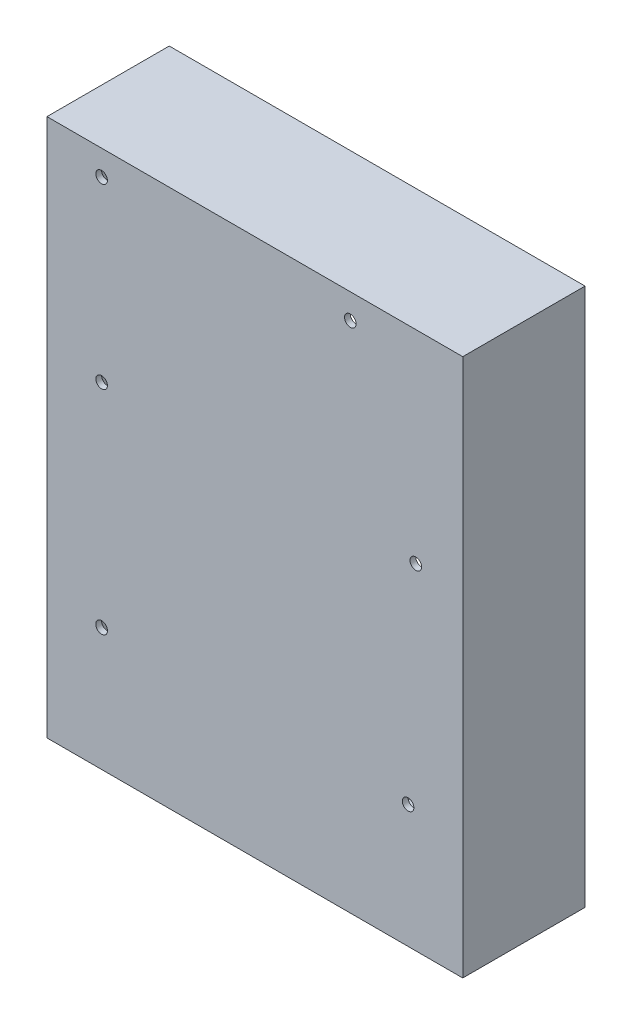
ISO-10303-21;
HEADER;
FILE_DESCRIPTION(('STEP AP214'),'2;1');
FILE_NAME('part.step','',(''),(''),'','','');
FILE_SCHEMA(('AUTOMOTIVE_DESIGN { 1 0 10303 214 1 1 1 1 }'));
ENDSEC;
DATA;
#1=APPLICATION_CONTEXT('core data for automotive mechanical design processes');
#2=APPLICATION_PROTOCOL_DEFINITION('international standard','automotive_design',2000,#1);
#3=PRODUCT_CONTEXT('',#1,'mechanical');
#4=PRODUCT('Part','Part','',(#3));
#5=PRODUCT_RELATED_PRODUCT_CATEGORY('part','',(#4));
#6=PRODUCT_DEFINITION_FORMATION('','',#4);
#7=PRODUCT_DEFINITION_CONTEXT('part definition',#1,'design');
#8=PRODUCT_DEFINITION('design','',#6,#7);
#9=PRODUCT_DEFINITION_SHAPE('','',#8);
#10=(LENGTH_UNIT() NAMED_UNIT(*) SI_UNIT(.MILLI.,.METRE.));
#11=(NAMED_UNIT(*) PLANE_ANGLE_UNIT() SI_UNIT($,.RADIAN.));
#12=(NAMED_UNIT(*) SI_UNIT($,.STERADIAN.) SOLID_ANGLE_UNIT());
#13=UNCERTAINTY_MEASURE_WITH_UNIT(LENGTH_MEASURE(1.E-05),#10,'distance_accuracy_value','');
#14=(GEOMETRIC_REPRESENTATION_CONTEXT(3) GLOBAL_UNCERTAINTY_ASSIGNED_CONTEXT((#13)) GLOBAL_UNIT_ASSIGNED_CONTEXT((#10,
#11,#12)) REPRESENTATION_CONTEXT('',''));
#15=CARTESIAN_POINT('',(0.,0.,0.));
#16=DIRECTION('',(0.,0.,1.));
#17=DIRECTION('',(1.,0.,0.));
#18=AXIS2_PLACEMENT_3D('',#15,#16,#17);
#19=CARTESIAN_POINT('',(-118.99799036646,197.340345361075,3.));
#20=DIRECTION('',(1.,0.,0.));
#21=DIRECTION('',(0.,1.,0.));
#22=AXIS2_PLACEMENT_3D('',#19,#20,#21);
#23=PLANE('',#22);
#24=DIRECTION('',(0.,0.,-1.));
#25=VECTOR('',#24,1.);
#26=CARTESIAN_POINT('',(-118.99799036646,197.340345361075,3.));
#27=LINE('',#26,#25);
#28=CARTESIAN_POINT('',(-118.99799036646,197.340345361075,3.));
#29=VERTEX_POINT('',#28);
#30=CARTESIAN_POINT('',(-118.99799036646,197.340345361075,-60.5));
#31=VERTEX_POINT('',#30);
#32=EDGE_CURVE('E154',#29,#31,#27,.T.);
#33=ORIENTED_EDGE('',*,*,#32,.T.);
#34=DIRECTION('',(0.,-1.,0.));
#35=VECTOR('',#34,1.);
#36=CARTESIAN_POINT('',(-118.99799036646,197.340345361075,-60.5));
#37=LINE('',#36,#35);
#38=CARTESIAN_POINT('',(-118.99799036646,-82.0596546389253,-60.5));
#39=VERTEX_POINT('',#38);
#40=EDGE_CURVE('E142',#31,#39,#37,.T.);
#41=ORIENTED_EDGE('',*,*,#40,.T.);
#42=DIRECTION('',(0.,0.,-1.));
#43=VECTOR('',#42,1.);
#44=CARTESIAN_POINT('',(-118.99799036646,-82.0596546389253,3.));
#45=LINE('',#44,#43);
#46=CARTESIAN_POINT('',(-118.99799036646,-82.0596546389253,3.));
#47=VERTEX_POINT('',#46);
#48=EDGE_CURVE('E160',#47,#39,#45,.T.);
#49=ORIENTED_EDGE('',*,*,#48,.F.);
#50=DIRECTION('',(0.,-1.,0.));
#51=VECTOR('',#50,1.);
#52=CARTESIAN_POINT('',(-118.99799036646,197.340345361075,3.));
#53=LINE('',#52,#51);
#54=EDGE_CURVE('E145',#29,#47,#53,.T.);
#55=ORIENTED_EDGE('',*,*,#54,.F.);
#56=EDGE_LOOP('',(#33,#41,#49,#55));
#57=FACE_BOUND('',#56,.T.);
#58=ADVANCED_FACE('F35',(#57),#23,.F.);
#59=CARTESIAN_POINT('',(-118.99799036646,-82.0596546389253,3.));
#60=DIRECTION('',(0.,1.,0.));
#61=DIRECTION('',(0.,0.,1.));
#62=AXIS2_PLACEMENT_3D('',#59,#60,#61);
#63=PLANE('',#62);
#64=ORIENTED_EDGE('',*,*,#48,.T.);
#65=DIRECTION('',(1.,0.,0.));
#66=VECTOR('',#65,1.);
#67=CARTESIAN_POINT('',(-118.99799036646,-82.0596546389253,-60.5));
#68=LINE('',#67,#66);
#69=CARTESIAN_POINT('',(96.9020096335404,-82.0596546389253,-60.5));
#70=VERTEX_POINT('',#69);
#71=EDGE_CURVE('E129',#39,#70,#68,.T.);
#72=ORIENTED_EDGE('',*,*,#71,.T.);
#73=DIRECTION('',(0.,0.,-1.));
#74=VECTOR('',#73,1.);
#75=CARTESIAN_POINT('',(96.9020096335404,-82.0596546389253,3.));
#76=LINE('',#75,#74);
#77=CARTESIAN_POINT('',(96.9020096335404,-82.0596546389253,3.));
#78=VERTEX_POINT('',#77);
#79=EDGE_CURVE('E158',#78,#70,#76,.T.);
#80=ORIENTED_EDGE('',*,*,#79,.F.);
#81=DIRECTION('',(1.,0.,0.));
#82=VECTOR('',#81,1.);
#83=CARTESIAN_POINT('',(-118.99799036646,-82.0596546389253,3.));
#84=LINE('',#83,#82);
#85=EDGE_CURVE('E148',#47,#78,#84,.T.);
#86=ORIENTED_EDGE('',*,*,#85,.F.);
#87=EDGE_LOOP('',(#64,#72,#80,#86));
#88=FACE_BOUND('',#87,.T.);
#89=ADVANCED_FACE('F187',(#88),#63,.F.);
#90=CARTESIAN_POINT('',(96.9020096335403,197.340345361075,3.));
#91=DIRECTION('',(-1.,0.,0.));
#92=DIRECTION('',(0.,-1.,0.));
#93=AXIS2_PLACEMENT_3D('',#90,#91,#92);
#94=PLANE('',#93);
#95=ORIENTED_EDGE('',*,*,#79,.T.);
#96=DIRECTION('',(0.,1.,0.));
#97=VECTOR('',#96,1.);
#98=CARTESIAN_POINT('',(96.9020096335404,-82.0596546389253,-60.5));
#99=LINE('',#98,#97);
#100=CARTESIAN_POINT('',(96.9020096335403,197.340345361075,-60.5));
#101=VERTEX_POINT('',#100);
#102=EDGE_CURVE('E136',#70,#101,#99,.T.);
#103=ORIENTED_EDGE('',*,*,#102,.T.);
#104=DIRECTION('',(0.,0.,-1.));
#105=VECTOR('',#104,1.);
#106=CARTESIAN_POINT('',(96.9020096335403,197.340345361075,3.));
#107=LINE('',#106,#105);
#108=CARTESIAN_POINT('',(96.9020096335403,197.340345361075,3.));
#109=VERTEX_POINT('',#108);
#110=EDGE_CURVE('E156',#109,#101,#107,.T.);
#111=ORIENTED_EDGE('',*,*,#110,.F.);
#112=DIRECTION('',(0.,1.,0.));
#113=VECTOR('',#112,1.);
#114=CARTESIAN_POINT('',(96.9020096335403,197.340345361075,3.));
#115=LINE('',#114,#113);
#116=EDGE_CURVE('E150',#78,#109,#115,.T.);
#117=ORIENTED_EDGE('',*,*,#116,.F.);
#118=EDGE_LOOP('',(#95,#103,#111,#117));
#119=FACE_BOUND('',#118,.T.);
#120=ADVANCED_FACE('F192',(#119),#94,.F.);
#121=CARTESIAN_POINT('',(-118.99799036646,197.340345361075,3.));
#122=DIRECTION('',(0.,-1.,0.));
#123=DIRECTION('',(1.,0.,0.));
#124=AXIS2_PLACEMENT_3D('',#121,#122,#123);
#125=PLANE('',#124);
#126=ORIENTED_EDGE('',*,*,#110,.T.);
#127=DIRECTION('',(-1.,0.,0.));
#128=VECTOR('',#127,1.);
#129=CARTESIAN_POINT('',(96.9020096335403,197.340345361075,-60.5));
#130=LINE('',#129,#128);
#131=EDGE_CURVE('E139',#101,#31,#130,.T.);
#132=ORIENTED_EDGE('',*,*,#131,.T.);
#133=ORIENTED_EDGE('',*,*,#32,.F.);
#134=DIRECTION('',(-1.,0.,0.));
#135=VECTOR('',#134,1.);
#136=CARTESIAN_POINT('',(-118.99799036646,197.340345361075,3.));
#137=LINE('',#136,#135);
#138=EDGE_CURVE('E152',#109,#29,#137,.T.);
#139=ORIENTED_EDGE('',*,*,#138,.F.);
#140=EDGE_LOOP('',(#126,#132,#133,#139));
#141=FACE_BOUND('',#140,.T.);
#142=ADVANCED_FACE('F201',(#141),#125,.F.);
#143=CARTESIAN_POINT('',(0.,0.,3.));
#144=DIRECTION('',(0.,0.,1.));
#145=DIRECTION('',(1.,0.,0.));
#146=AXIS2_PLACEMENT_3D('',#143,#144,#145);
#147=PLANE('',#146);
#148=CARTESIAN_POINT('',(-90.6129903664599,92.0803453610748,3.));
#149=DIRECTION('',(0.,0.,1.));
#150=DIRECTION('',(1.,0.,0.));
#151=AXIS2_PLACEMENT_3D('',#148,#149,#150);
#152=CIRCLE('',#151,2.99999999999999);
#153=CARTESIAN_POINT('',(-87.6129903664599,92.0803453610748,3.));
#154=VERTEX_POINT('',#153);
#155=EDGE_CURVE('E118',#154,#154,#152,.T.);
#156=ORIENTED_EDGE('',*,*,#155,.F.);
#157=EDGE_LOOP('',(#156));
#158=FACE_BOUND('',#157,.T.);
#159=CARTESIAN_POINT('',(68.5170096335401,-18.1796546389251,3.));
#160=DIRECTION('',(0.,0.,1.));
#161=DIRECTION('',(1.,0.,0.));
#162=AXIS2_PLACEMENT_3D('',#159,#160,#161);
#163=CIRCLE('',#162,3.00000000000001);
#164=CARTESIAN_POINT('',(71.5170096335401,-18.1796546389251,3.));
#165=VERTEX_POINT('',#164);
#166=EDGE_CURVE('E121',#165,#165,#163,.T.);
#167=ORIENTED_EDGE('',*,*,#166,.F.);
#168=EDGE_LOOP('',(#167));
#169=FACE_BOUND('',#168,.T.);
#170=CARTESIAN_POINT('',(38.5170096335401,184.340345361075,3.));
#171=DIRECTION('',(0.,0.,1.));
#172=DIRECTION('',(1.,0.,0.));
#173=AXIS2_PLACEMENT_3D('',#170,#171,#172);
#174=CIRCLE('',#173,3.);
#175=CARTESIAN_POINT('',(41.5170096335401,184.340345361075,3.));
#176=VERTEX_POINT('',#175);
#177=EDGE_CURVE('E284',#176,#176,#174,.T.);
#178=ORIENTED_EDGE('',*,*,#177,.F.);
#179=EDGE_LOOP('',(#178));
#180=FACE_BOUND('',#179,.T.);
#181=CARTESIAN_POINT('',(-90.6129903664599,184.340345361075,3.));
#182=DIRECTION('',(0.,0.,1.));
#183=DIRECTION('',(1.,0.,0.));
#184=AXIS2_PLACEMENT_3D('',#181,#182,#183);
#185=CIRCLE('',#184,2.99999999999999);
#186=CARTESIAN_POINT('',(-87.6129903664599,184.340345361075,3.));
#187=VERTEX_POINT('',#186);
#188=EDGE_CURVE('E255',#187,#187,#185,.T.);
#189=ORIENTED_EDGE('',*,*,#188,.F.);
#190=EDGE_LOOP('',(#189));
#191=FACE_BOUND('',#190,.T.);
#192=CARTESIAN_POINT('',(-90.6129903664598,-18.1796546389252,3.));
#193=DIRECTION('',(0.,0.,1.));
#194=DIRECTION('',(1.,0.,0.));
#195=AXIS2_PLACEMENT_3D('',#192,#193,#194);
#196=CIRCLE('',#195,3.04999999999999);
#197=CARTESIAN_POINT('',(-87.5629903664598,-18.1796546389252,3.));
#198=VERTEX_POINT('',#197);
#199=EDGE_CURVE('E280',#198,#198,#196,.T.);
#200=ORIENTED_EDGE('',*,*,#199,.F.);
#201=EDGE_LOOP('',(#200));
#202=FACE_BOUND('',#201,.T.);
#203=CARTESIAN_POINT('',(72.5170096335401,92.0803453610749,3.));
#204=DIRECTION('',(0.,0.,1.));
#205=DIRECTION('',(1.,0.,0.));
#206=AXIS2_PLACEMENT_3D('',#203,#204,#205);
#207=CIRCLE('',#206,3.00000000000001);
#208=CARTESIAN_POINT('',(75.5170096335401,92.0803453610749,3.));
#209=VERTEX_POINT('',#208);
#210=EDGE_CURVE('E277',#209,#209,#207,.T.);
#211=ORIENTED_EDGE('',*,*,#210,.F.);
#212=EDGE_LOOP('',(#211));
#213=FACE_BOUND('',#212,.T.);
#214=ORIENTED_EDGE('',*,*,#54,.T.);
#215=ORIENTED_EDGE('',*,*,#85,.T.);
#216=ORIENTED_EDGE('',*,*,#116,.T.);
#217=ORIENTED_EDGE('',*,*,#138,.T.);
#218=EDGE_LOOP('',(#214,#215,#216,#217));
#219=FACE_BOUND('',#218,.T.);
#220=ADVANCED_FACE('F208',(#158,#169,#180,#191,#202,#213,#219),#147,.T.);
#221=CARTESIAN_POINT('',(93.9020096335403,194.340345361075,-60.5));
#222=DIRECTION('',(0.,1.,0.));
#223=DIRECTION('',(-1.,0.,0.));
#224=AXIS2_PLACEMENT_3D('',#221,#222,#223);
#225=PLANE('',#224);
#226=DIRECTION('',(0.,0.,1.));
#227=VECTOR('',#226,1.);
#228=CARTESIAN_POINT('',(93.9020096335403,194.340345361075,-60.5));
#229=LINE('',#228,#227);
#230=CARTESIAN_POINT('',(93.9020096335403,194.340345361075,-60.5));
#231=VERTEX_POINT('',#230);
#232=CARTESIAN_POINT('',(93.9020096335403,194.340345361075,0.));
#233=VERTEX_POINT('',#232);
#234=EDGE_CURVE('E127',#231,#233,#229,.T.);
#235=ORIENTED_EDGE('',*,*,#234,.T.);
#236=DIRECTION('',(-1.,0.,0.));
#237=VECTOR('',#236,1.);
#238=CARTESIAN_POINT('',(0.,194.340345361075,0.));
#239=LINE('',#238,#237);
#240=CARTESIAN_POINT('',(-115.99799036646,194.340345361075,0.));
#241=VERTEX_POINT('',#240);
#242=EDGE_CURVE('E11',#233,#241,#239,.T.);
#243=ORIENTED_EDGE('',*,*,#242,.T.);
#244=DIRECTION('',(0.,0.,1.));
#245=VECTOR('',#244,1.);
#246=CARTESIAN_POINT('',(-115.99799036646,194.340345361075,-60.5));
#247=LINE('',#246,#245);
#248=CARTESIAN_POINT('',(-115.99799036646,194.340345361075,-60.5));
#249=VERTEX_POINT('',#248);
#250=EDGE_CURVE('E94',#249,#241,#247,.T.);
#251=ORIENTED_EDGE('',*,*,#250,.F.);
#252=DIRECTION('',(-1.,0.,0.));
#253=VECTOR('',#252,1.);
#254=CARTESIAN_POINT('',(93.9020096335403,194.340345361075,-60.5));
#255=LINE('',#254,#253);
#256=EDGE_CURVE('E99',#231,#249,#255,.T.);
#257=ORIENTED_EDGE('',*,*,#256,.F.);
#258=EDGE_LOOP('',(#235,#243,#251,#257));
#259=FACE_BOUND('',#258,.T.);
#260=ADVANCED_FACE('F97',(#259),#225,.F.);
#261=CARTESIAN_POINT('',(93.9020096335404,-79.0596546389253,-60.5));
#262=DIRECTION('',(1.,0.,0.));
#263=DIRECTION('',(0.,1.,0.));
#264=AXIS2_PLACEMENT_3D('',#261,#262,#263);
#265=PLANE('',#264);
#266=DIRECTION('',(0.,0.,1.));
#267=VECTOR('',#266,1.);
#268=CARTESIAN_POINT('',(93.9020096335404,-79.0596546389253,-60.5));
#269=LINE('',#268,#267);
#270=CARTESIAN_POINT('',(93.9020096335404,-79.0596546389253,-60.5));
#271=VERTEX_POINT('',#270);
#272=CARTESIAN_POINT('',(93.9020096335404,-79.0596546389253,0.));
#273=VERTEX_POINT('',#272);
#274=EDGE_CURVE('E130',#271,#273,#269,.T.);
#275=ORIENTED_EDGE('',*,*,#274,.T.);
#276=DIRECTION('',(0.,1.,0.));
#277=VECTOR('',#276,1.);
#278=CARTESIAN_POINT('',(93.9020096335404,0.,0.));
#279=LINE('',#278,#277);
#280=EDGE_CURVE('E42',#273,#233,#279,.T.);
#281=ORIENTED_EDGE('',*,*,#280,.T.);
#282=ORIENTED_EDGE('',*,*,#234,.F.);
#283=DIRECTION('',(0.,1.,0.));
#284=VECTOR('',#283,1.);
#285=CARTESIAN_POINT('',(93.9020096335404,-79.0596546389253,-60.5));
#286=LINE('',#285,#284);
#287=EDGE_CURVE('E104',#271,#231,#286,.T.);
#288=ORIENTED_EDGE('',*,*,#287,.F.);
#289=EDGE_LOOP('',(#275,#281,#282,#288));
#290=FACE_BOUND('',#289,.T.);
#291=ADVANCED_FACE('F166',(#290),#265,.F.);
#292=CARTESIAN_POINT('',(-115.99799036646,-79.0596546389253,-60.5));
#293=DIRECTION('',(0.,-1.,0.));
#294=DIRECTION('',(0.,0.,-1.));
#295=AXIS2_PLACEMENT_3D('',#292,#293,#294);
#296=PLANE('',#295);
#297=DIRECTION('',(0.,0.,1.));
#298=VECTOR('',#297,1.);
#299=CARTESIAN_POINT('',(-115.99799036646,-79.0596546389253,-60.5));
#300=LINE('',#299,#298);
#301=CARTESIAN_POINT('',(-115.99799036646,-79.0596546389253,-60.5));
#302=VERTEX_POINT('',#301);
#303=CARTESIAN_POINT('',(-115.99799036646,-79.0596546389253,0.));
#304=VERTEX_POINT('',#303);
#305=EDGE_CURVE('E103',#302,#304,#300,.T.);
#306=ORIENTED_EDGE('',*,*,#305,.T.);
#307=DIRECTION('',(1.,0.,0.));
#308=VECTOR('',#307,1.);
#309=CARTESIAN_POINT('',(0.,-79.0596546389253,0.));
#310=LINE('',#309,#308);
#311=EDGE_CURVE('E164',#304,#273,#310,.T.);
#312=ORIENTED_EDGE('',*,*,#311,.T.);
#313=ORIENTED_EDGE('',*,*,#274,.F.);
#314=DIRECTION('',(1.,0.,0.));
#315=VECTOR('',#314,1.);
#316=CARTESIAN_POINT('',(-115.99799036646,-79.0596546389253,-60.5));
#317=LINE('',#316,#315);
#318=EDGE_CURVE('E113',#302,#271,#317,.T.);
#319=ORIENTED_EDGE('',*,*,#318,.F.);
#320=EDGE_LOOP('',(#306,#312,#313,#319));
#321=FACE_BOUND('',#320,.T.);
#322=ADVANCED_FACE('F168',(#321),#296,.F.);
#323=CARTESIAN_POINT('',(-115.99799036646,194.340345361075,-60.5));
#324=DIRECTION('',(-1.,0.,0.));
#325=DIRECTION('',(0.,-1.,0.));
#326=AXIS2_PLACEMENT_3D('',#323,#324,#325);
#327=PLANE('',#326);
#328=ORIENTED_EDGE('',*,*,#250,.T.);
#329=DIRECTION('',(0.,-1.,0.));
#330=VECTOR('',#329,1.);
#331=CARTESIAN_POINT('',(-115.99799036646,0.,0.));
#332=LINE('',#331,#330);
#333=EDGE_CURVE('E162',#241,#304,#332,.T.);
#334=ORIENTED_EDGE('',*,*,#333,.T.);
#335=ORIENTED_EDGE('',*,*,#305,.F.);
#336=DIRECTION('',(0.,-1.,0.));
#337=VECTOR('',#336,1.);
#338=CARTESIAN_POINT('',(-115.99799036646,194.340345361075,-60.5));
#339=LINE('',#338,#337);
#340=EDGE_CURVE('E108',#249,#302,#339,.T.);
#341=ORIENTED_EDGE('',*,*,#340,.F.);
#342=EDGE_LOOP('',(#328,#334,#335,#341));
#343=FACE_BOUND('',#342,.T.);
#344=ADVANCED_FACE('F109',(#343),#327,.F.);
#345=CARTESIAN_POINT('',(0.,0.,-60.5));
#346=DIRECTION('',(0.,0.,1.));
#347=DIRECTION('',(1.,0.,0.));
#348=AXIS2_PLACEMENT_3D('',#345,#346,#347);
#349=PLANE('',#348);
#350=ORIENTED_EDGE('',*,*,#287,.T.);
#351=ORIENTED_EDGE('',*,*,#256,.T.);
#352=ORIENTED_EDGE('',*,*,#340,.T.);
#353=ORIENTED_EDGE('',*,*,#318,.T.);
#354=EDGE_LOOP('',(#350,#351,#352,#353));
#355=FACE_BOUND('',#354,.T.);
#356=ORIENTED_EDGE('',*,*,#71,.F.);
#357=ORIENTED_EDGE('',*,*,#40,.F.);
#358=ORIENTED_EDGE('',*,*,#131,.F.);
#359=ORIENTED_EDGE('',*,*,#102,.F.);
#360=EDGE_LOOP('',(#356,#357,#358,#359));
#361=FACE_BOUND('',#360,.T.);
#362=ADVANCED_FACE('F115',(#355,#361),#349,.F.);
#363=CARTESIAN_POINT('',(0.,0.,0.));
#364=DIRECTION('',(0.,0.,1.));
#365=DIRECTION('',(1.,0.,0.));
#366=AXIS2_PLACEMENT_3D('',#363,#364,#365);
#367=PLANE('',#366);
#368=CARTESIAN_POINT('',(-90.6129903664599,92.0803453610748,0.));
#369=DIRECTION('',(0.,0.,-1.));
#370=DIRECTION('',(-1.,0.,0.));
#371=AXIS2_PLACEMENT_3D('',#368,#369,#370);
#372=CIRCLE('',#371,2.99999999999999);
#373=CARTESIAN_POINT('',(-93.6129903664599,92.0803453610748,0.));
#374=VERTEX_POINT('',#373);
#375=EDGE_CURVE('E260',#374,#374,#372,.T.);
#376=ORIENTED_EDGE('',*,*,#375,.F.);
#377=EDGE_LOOP('',(#376));
#378=FACE_BOUND('',#377,.T.);
#379=CARTESIAN_POINT('',(68.5170096335401,-18.1796546389251,0.));
#380=DIRECTION('',(0.,0.,-1.));
#381=DIRECTION('',(-1.,0.,0.));
#382=AXIS2_PLACEMENT_3D('',#379,#380,#381);
#383=CIRCLE('',#382,3.00000000000001);
#384=CARTESIAN_POINT('',(65.5170096335401,-18.1796546389251,0.));
#385=VERTEX_POINT('',#384);
#386=EDGE_CURVE('E264',#385,#385,#383,.T.);
#387=ORIENTED_EDGE('',*,*,#386,.F.);
#388=EDGE_LOOP('',(#387));
#389=FACE_BOUND('',#388,.T.);
#390=CARTESIAN_POINT('',(38.5170096335401,184.340345361075,0.));
#391=DIRECTION('',(0.,0.,-1.));
#392=DIRECTION('',(-1.,0.,0.));
#393=AXIS2_PLACEMENT_3D('',#390,#391,#392);
#394=CIRCLE('',#393,3.);
#395=CARTESIAN_POINT('',(35.5170096335401,184.340345361075,0.));
#396=VERTEX_POINT('',#395);
#397=EDGE_CURVE('E269',#396,#396,#394,.T.);
#398=ORIENTED_EDGE('',*,*,#397,.F.);
#399=EDGE_LOOP('',(#398));
#400=FACE_BOUND('',#399,.T.);
#401=CARTESIAN_POINT('',(-90.6129903664599,184.340345361075,0.));
#402=DIRECTION('',(0.,0.,-1.));
#403=DIRECTION('',(-1.,0.,0.));
#404=AXIS2_PLACEMENT_3D('',#401,#402,#403);
#405=CIRCLE('',#404,2.99999999999999);
#406=CARTESIAN_POINT('',(-93.6129903664599,184.340345361075,0.));
#407=VERTEX_POINT('',#406);
#408=EDGE_CURVE('E258',#407,#407,#405,.T.);
#409=ORIENTED_EDGE('',*,*,#408,.F.);
#410=EDGE_LOOP('',(#409));
#411=FACE_BOUND('',#410,.T.);
#412=CARTESIAN_POINT('',(-90.6129903664598,-18.1796546389252,0.));
#413=DIRECTION('',(0.,0.,-1.));
#414=DIRECTION('',(-1.,0.,0.));
#415=AXIS2_PLACEMENT_3D('',#412,#413,#414);
#416=CIRCLE('',#415,3.04999999999999);
#417=CARTESIAN_POINT('',(-93.6629903664598,-18.1796546389252,0.));
#418=VERTEX_POINT('',#417);
#419=EDGE_CURVE('E261',#418,#418,#416,.T.);
#420=ORIENTED_EDGE('',*,*,#419,.F.);
#421=EDGE_LOOP('',(#420));
#422=FACE_BOUND('',#421,.T.);
#423=CARTESIAN_POINT('',(72.5170096335401,92.0803453610749,0.));
#424=DIRECTION('',(0.,0.,-1.));
#425=DIRECTION('',(-1.,0.,0.));
#426=AXIS2_PLACEMENT_3D('',#423,#424,#425);
#427=CIRCLE('',#426,3.00000000000001);
#428=CARTESIAN_POINT('',(69.5170096335401,92.0803453610749,0.));
#429=VERTEX_POINT('',#428);
#430=EDGE_CURVE('E272',#429,#429,#427,.T.);
#431=ORIENTED_EDGE('',*,*,#430,.F.);
#432=EDGE_LOOP('',(#431));
#433=FACE_BOUND('',#432,.T.);
#434=ORIENTED_EDGE('',*,*,#242,.F.);
#435=ORIENTED_EDGE('',*,*,#280,.F.);
#436=ORIENTED_EDGE('',*,*,#311,.F.);
#437=ORIENTED_EDGE('',*,*,#333,.F.);
#438=EDGE_LOOP('',(#434,#435,#436,#437));
#439=FACE_BOUND('',#438,.T.);
#440=ADVANCED_FACE('F169',(#378,#389,#400,#411,#422,#433,#439),#367,.F.);
#441=CARTESIAN_POINT('',(72.5170096335401,92.0803453610749,5.));
#442=DIRECTION('',(0.,0.,-1.));
#443=DIRECTION('',(-1.,0.,0.));
#444=AXIS2_PLACEMENT_3D('',#441,#442,#443);
#445=CYLINDRICAL_SURFACE('',#444,3.00000000000001);
#446=ORIENTED_EDGE('',*,*,#210,.T.);
#447=EDGE_LOOP('',(#446));
#448=FACE_BOUND('',#447,.T.);
#449=ORIENTED_EDGE('',*,*,#430,.T.);
#450=EDGE_LOOP('',(#449));
#451=FACE_BOUND('',#450,.T.);
#452=ADVANCED_FACE('F171',(#448,#451),#445,.F.);
#453=CARTESIAN_POINT('',(-90.6129903664598,-18.1796546389252,5.));
#454=DIRECTION('',(0.,0.,-1.));
#455=DIRECTION('',(-1.,0.,0.));
#456=AXIS2_PLACEMENT_3D('',#453,#454,#455);
#457=CYLINDRICAL_SURFACE('',#456,3.04999999999999);
#458=ORIENTED_EDGE('',*,*,#199,.T.);
#459=EDGE_LOOP('',(#458));
#460=FACE_BOUND('',#459,.T.);
#461=ORIENTED_EDGE('',*,*,#419,.T.);
#462=EDGE_LOOP('',(#461));
#463=FACE_BOUND('',#462,.T.);
#464=ADVANCED_FACE('F178',(#460,#463),#457,.F.);
#465=CARTESIAN_POINT('',(-90.6129903664599,184.340345361075,5.));
#466=DIRECTION('',(0.,0.,-1.));
#467=DIRECTION('',(-1.,0.,0.));
#468=AXIS2_PLACEMENT_3D('',#465,#466,#467);
#469=CYLINDRICAL_SURFACE('',#468,2.99999999999999);
#470=ORIENTED_EDGE('',*,*,#188,.T.);
#471=EDGE_LOOP('',(#470));
#472=FACE_BOUND('',#471,.T.);
#473=ORIENTED_EDGE('',*,*,#408,.T.);
#474=EDGE_LOOP('',(#473));
#475=FACE_BOUND('',#474,.T.);
#476=ADVANCED_FACE('F240',(#472,#475),#469,.F.);
#477=CARTESIAN_POINT('',(38.5170096335401,184.340345361075,5.));
#478=DIRECTION('',(0.,0.,-1.));
#479=DIRECTION('',(-1.,0.,0.));
#480=AXIS2_PLACEMENT_3D('',#477,#478,#479);
#481=CYLINDRICAL_SURFACE('',#480,3.);
#482=ORIENTED_EDGE('',*,*,#177,.T.);
#483=EDGE_LOOP('',(#482));
#484=FACE_BOUND('',#483,.T.);
#485=ORIENTED_EDGE('',*,*,#397,.T.);
#486=EDGE_LOOP('',(#485));
#487=FACE_BOUND('',#486,.T.);
#488=ADVANCED_FACE('F236',(#484,#487),#481,.F.);
#489=CARTESIAN_POINT('',(68.5170096335401,-18.1796546389251,5.));
#490=DIRECTION('',(0.,0.,-1.));
#491=DIRECTION('',(-1.,0.,0.));
#492=AXIS2_PLACEMENT_3D('',#489,#490,#491);
#493=CYLINDRICAL_SURFACE('',#492,3.00000000000001);
#494=ORIENTED_EDGE('',*,*,#166,.T.);
#495=EDGE_LOOP('',(#494));
#496=FACE_BOUND('',#495,.T.);
#497=ORIENTED_EDGE('',*,*,#386,.T.);
#498=EDGE_LOOP('',(#497));
#499=FACE_BOUND('',#498,.T.);
#500=ADVANCED_FACE('F232',(#496,#499),#493,.F.);
#501=CARTESIAN_POINT('',(-90.6129903664599,92.0803453610748,5.));
#502=DIRECTION('',(0.,0.,-1.));
#503=DIRECTION('',(-1.,0.,0.));
#504=AXIS2_PLACEMENT_3D('',#501,#502,#503);
#505=CYLINDRICAL_SURFACE('',#504,2.99999999999999);
#506=ORIENTED_EDGE('',*,*,#155,.T.);
#507=EDGE_LOOP('',(#506));
#508=FACE_BOUND('',#507,.T.);
#509=ORIENTED_EDGE('',*,*,#375,.T.);
#510=EDGE_LOOP('',(#509));
#511=FACE_BOUND('',#510,.T.);
#512=ADVANCED_FACE('F235',(#508,#511),#505,.F.);
#513=CLOSED_SHELL('',(#58,#89,#120,#142,#220,#260,#291,#322,#344,#362,#440,#452,#464,#476,#488,
#500,#512));
#514=MANIFOLD_SOLID_BREP('B2',#513);
#515=ADVANCED_BREP_SHAPE_REPRESENTATION('',(#18,#514),#14);
#516=SHAPE_DEFINITION_REPRESENTATION(#9,#515);
ENDSEC;
END-ISO-10303-21;
